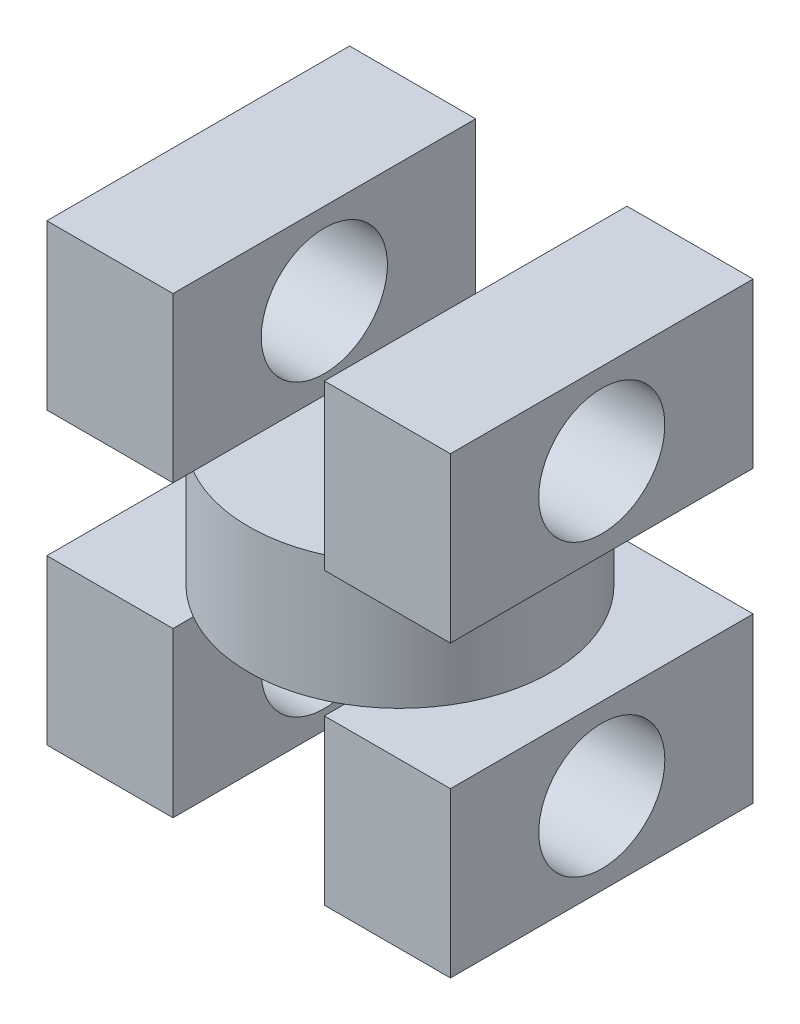
ISO-10303-21;
HEADER;
FILE_DESCRIPTION(('STEP AP214'),'2;1');
FILE_NAME('part.step','',(''),(''),'','','');
FILE_SCHEMA(('AUTOMOTIVE_DESIGN { 1 0 10303 214 1 1 1 1 }'));
ENDSEC;
DATA;
#1=APPLICATION_CONTEXT('core data for automotive mechanical design processes');
#2=APPLICATION_PROTOCOL_DEFINITION('international standard','automotive_design',2000,#1);
#3=PRODUCT_CONTEXT('',#1,'mechanical');
#4=PRODUCT('Part','Part','',(#3));
#5=PRODUCT_RELATED_PRODUCT_CATEGORY('part','',(#4));
#6=PRODUCT_DEFINITION_FORMATION('','',#4);
#7=PRODUCT_DEFINITION_CONTEXT('part definition',#1,'design');
#8=PRODUCT_DEFINITION('design','',#6,#7);
#9=PRODUCT_DEFINITION_SHAPE('','',#8);
#10=(LENGTH_UNIT() NAMED_UNIT(*) SI_UNIT(.MILLI.,.METRE.));
#11=(NAMED_UNIT(*) PLANE_ANGLE_UNIT() SI_UNIT($,.RADIAN.));
#12=(NAMED_UNIT(*) SI_UNIT($,.STERADIAN.) SOLID_ANGLE_UNIT());
#13=UNCERTAINTY_MEASURE_WITH_UNIT(LENGTH_MEASURE(1.E-05),#10,'distance_accuracy_value','');
#14=(GEOMETRIC_REPRESENTATION_CONTEXT(3) GLOBAL_UNCERTAINTY_ASSIGNED_CONTEXT((#13)) GLOBAL_UNIT_ASSIGNED_CONTEXT((#10,
#11,#12)) REPRESENTATION_CONTEXT('',''));
#15=CARTESIAN_POINT('',(0.,0.,0.));
#16=DIRECTION('',(0.,0.,1.));
#17=DIRECTION('',(1.,0.,0.));
#18=AXIS2_PLACEMENT_3D('',#15,#16,#17);
#19=CARTESIAN_POINT('',(-32.,-10.,24.));
#20=DIRECTION('',(0.,1.,0.));
#21=DIRECTION('',(0.,0.,1.));
#22=AXIS2_PLACEMENT_3D('',#19,#20,#21);
#23=PLANE('',#22);
#24=DIRECTION('',(1.,0.,0.));
#25=VECTOR('',#24,1.);
#26=CARTESIAN_POINT('',(-32.,-10.,0.));
#27=LINE('',#26,#25);
#28=CARTESIAN_POINT('',(-10.,-10.,0.));
#29=VERTEX_POINT('',#28);
#30=CARTESIAN_POINT('',(0.,-10.,0.));
#31=VERTEX_POINT('',#30);
#32=EDGE_CURVE('E240',#29,#31,#27,.T.);
#33=ORIENTED_EDGE('',*,*,#32,.F.);
#34=DIRECTION('',(0.,0.,-1.));
#35=VECTOR('',#34,1.);
#36=CARTESIAN_POINT('',(-10.,-10.,24.));
#37=LINE('',#36,#35);
#38=CARTESIAN_POINT('',(-10.,-10.,1.60769515458673));
#39=VERTEX_POINT('',#38);
#40=EDGE_CURVE('E61',#39,#29,#37,.T.);
#41=ORIENTED_EDGE('',*,*,#40,.F.);
#42=CARTESIAN_POINT('',(-16.,-10.,12.));
#43=DIRECTION('',(0.,-1.,0.));
#44=DIRECTION('',(0.,0.,-1.));
#45=AXIS2_PLACEMENT_3D('',#42,#43,#44);
#46=CIRCLE('',#45,12.);
#47=CARTESIAN_POINT('',(-10.,-10.,22.3923048454133));
#48=VERTEX_POINT('',#47);
#49=EDGE_CURVE('E204',#39,#48,#46,.T.);
#50=ORIENTED_EDGE('',*,*,#49,.T.);
#51=CARTESIAN_POINT('',(-10.,-10.,24.));
#52=VERTEX_POINT('',#51);
#53=EDGE_CURVE('E186',#52,#48,#37,.T.);
#54=ORIENTED_EDGE('',*,*,#53,.F.);
#55=DIRECTION('',(1.,0.,0.));
#56=VECTOR('',#55,1.);
#57=CARTESIAN_POINT('',(-32.,-10.,24.));
#58=LINE('',#57,#56);
#59=CARTESIAN_POINT('',(0.,-10.,24.));
#60=VERTEX_POINT('',#59);
#61=EDGE_CURVE('E201',#52,#60,#58,.T.);
#62=ORIENTED_EDGE('',*,*,#61,.T.);
#63=DIRECTION('',(0.,0.,-1.));
#64=VECTOR('',#63,1.);
#65=CARTESIAN_POINT('',(0.,-10.,24.));
#66=LINE('',#65,#64);
#67=EDGE_CURVE('E234',#60,#31,#66,.T.);
#68=ORIENTED_EDGE('',*,*,#67,.T.);
#69=EDGE_LOOP('',(#33,#41,#50,#54,#62,#68));
#70=FACE_BOUND('',#69,.T.);
#71=ADVANCED_FACE('F43',(#70),#23,.T.);
#72=CARTESIAN_POINT('',(-32.,-10.,24.));
#73=VERTEX_POINT('',#72);
#74=CARTESIAN_POINT('',(-22.,-10.,24.));
#75=VERTEX_POINT('',#74);
#76=EDGE_CURVE('E213',#73,#75,#58,.T.);
#77=ORIENTED_EDGE('',*,*,#76,.T.);
#78=DIRECTION('',(0.,0.,-1.));
#79=VECTOR('',#78,1.);
#80=CARTESIAN_POINT('',(-22.,-10.,24.));
#81=LINE('',#80,#79);
#82=CARTESIAN_POINT('',(-22.,-10.,22.3923048454133));
#83=VERTEX_POINT('',#82);
#84=EDGE_CURVE('E384',#75,#83,#81,.T.);
#85=ORIENTED_EDGE('',*,*,#84,.T.);
#86=CARTESIAN_POINT('',(-22.,-10.,1.60769515458674));
#87=VERTEX_POINT('',#86);
#88=EDGE_CURVE('E313',#83,#87,#46,.T.);
#89=ORIENTED_EDGE('',*,*,#88,.T.);
#90=CARTESIAN_POINT('',(-22.,-10.,0.));
#91=VERTEX_POINT('',#90);
#92=EDGE_CURVE('E389',#87,#91,#81,.T.);
#93=ORIENTED_EDGE('',*,*,#92,.T.);
#94=CARTESIAN_POINT('',(-32.,-10.,0.));
#95=VERTEX_POINT('',#94);
#96=EDGE_CURVE('E235',#95,#91,#27,.T.);
#97=ORIENTED_EDGE('',*,*,#96,.F.);
#98=DIRECTION('',(0.,0.,-1.));
#99=VECTOR('',#98,1.);
#100=CARTESIAN_POINT('',(-32.,-10.,24.));
#101=LINE('',#100,#99);
#102=EDGE_CURVE('E257',#73,#95,#101,.T.);
#103=ORIENTED_EDGE('',*,*,#102,.F.);
#104=EDGE_LOOP('',(#77,#85,#89,#93,#97,#103));
#105=FACE_BOUND('',#104,.T.);
#106=ADVANCED_FACE('F410',(#105),#23,.T.);
#107=CARTESIAN_POINT('',(0.,-23.,24.));
#108=DIRECTION('',(0.,-1.,0.));
#109=DIRECTION('',(1.,0.,0.));
#110=AXIS2_PLACEMENT_3D('',#107,#108,#109);
#111=PLANE('',#110);
#112=DIRECTION('',(-1.,0.,0.));
#113=VECTOR('',#112,1.);
#114=CARTESIAN_POINT('',(0.,-23.,0.));
#115=LINE('',#114,#113);
#116=CARTESIAN_POINT('',(-22.,-23.,0.));
#117=VERTEX_POINT('',#116);
#118=CARTESIAN_POINT('',(-32.,-23.,0.));
#119=VERTEX_POINT('',#118);
#120=EDGE_CURVE('E244',#117,#119,#115,.T.);
#121=ORIENTED_EDGE('',*,*,#120,.F.);
#122=DIRECTION('',(0.,0.,-1.));
#123=VECTOR('',#122,1.);
#124=CARTESIAN_POINT('',(-22.,-23.,24.));
#125=LINE('',#124,#123);
#126=CARTESIAN_POINT('',(-22.,-23.,24.));
#127=VERTEX_POINT('',#126);
#128=EDGE_CURVE('E390',#127,#117,#125,.T.);
#129=ORIENTED_EDGE('',*,*,#128,.F.);
#130=DIRECTION('',(-1.,0.,0.));
#131=VECTOR('',#130,1.);
#132=CARTESIAN_POINT('',(0.,-23.,24.));
#133=LINE('',#132,#131);
#134=CARTESIAN_POINT('',(-32.,-23.,24.));
#135=VERTEX_POINT('',#134);
#136=EDGE_CURVE('E228',#127,#135,#133,.T.);
#137=ORIENTED_EDGE('',*,*,#136,.T.);
#138=DIRECTION('',(0.,0.,-1.));
#139=VECTOR('',#138,1.);
#140=CARTESIAN_POINT('',(-32.,-23.,24.));
#141=LINE('',#140,#139);
#142=EDGE_CURVE('E253',#135,#119,#141,.T.);
#143=ORIENTED_EDGE('',*,*,#142,.T.);
#144=EDGE_LOOP('',(#121,#129,#137,#143));
#145=FACE_BOUND('',#144,.T.);
#146=ADVANCED_FACE('F430',(#145),#111,.T.);
#147=CARTESIAN_POINT('',(0.,-23.,24.));
#148=VERTEX_POINT('',#147);
#149=CARTESIAN_POINT('',(-10.,-23.,24.));
#150=VERTEX_POINT('',#149);
#151=EDGE_CURVE('E229',#148,#150,#133,.T.);
#152=ORIENTED_EDGE('',*,*,#151,.T.);
#153=DIRECTION('',(0.,0.,-1.));
#154=VECTOR('',#153,1.);
#155=CARTESIAN_POINT('',(-10.,-23.,24.));
#156=LINE('',#155,#154);
#157=CARTESIAN_POINT('',(-10.,-23.,0.));
#158=VERTEX_POINT('',#157);
#159=EDGE_CURVE('E189',#150,#158,#156,.T.);
#160=ORIENTED_EDGE('',*,*,#159,.T.);
#161=CARTESIAN_POINT('',(0.,-23.,0.));
#162=VERTEX_POINT('',#161);
#163=EDGE_CURVE('E221',#162,#158,#115,.T.);
#164=ORIENTED_EDGE('',*,*,#163,.F.);
#165=DIRECTION('',(0.,0.,-1.));
#166=VECTOR('',#165,1.);
#167=CARTESIAN_POINT('',(0.,-23.,24.));
#168=LINE('',#167,#166);
#169=EDGE_CURVE('E250',#148,#162,#168,.T.);
#170=ORIENTED_EDGE('',*,*,#169,.F.);
#171=EDGE_LOOP('',(#152,#160,#164,#170));
#172=FACE_BOUND('',#171,.T.);
#173=ADVANCED_FACE('F395',(#172),#111,.T.);
#174=CARTESIAN_POINT('',(0.,-10.,24.));
#175=DIRECTION('',(0.,0.,1.));
#176=DIRECTION('',(1.,0.,0.));
#177=AXIS2_PLACEMENT_3D('',#174,#175,#176);
#178=PLANE('',#177);
#179=ORIENTED_EDGE('',*,*,#136,.F.);
#180=DIRECTION('',(0.,-1.,0.));
#181=VECTOR('',#180,1.);
#182=CARTESIAN_POINT('',(-22.,-10.,24.));
#183=LINE('',#182,#181);
#184=EDGE_CURVE('E195',#75,#127,#183,.T.);
#185=ORIENTED_EDGE('',*,*,#184,.F.);
#186=ORIENTED_EDGE('',*,*,#76,.F.);
#187=DIRECTION('',(0.,1.,0.));
#188=VECTOR('',#187,1.);
#189=CARTESIAN_POINT('',(-32.,-23.,24.));
#190=LINE('',#189,#188);
#191=EDGE_CURVE('E219',#135,#73,#190,.T.);
#192=ORIENTED_EDGE('',*,*,#191,.F.);
#193=EDGE_LOOP('',(#179,#185,#186,#192));
#194=FACE_BOUND('',#193,.T.);
#195=ADVANCED_FACE('F426',(#194),#178,.T.);
#196=ORIENTED_EDGE('',*,*,#61,.F.);
#197=DIRECTION('',(0.,1.,0.));
#198=VECTOR('',#197,1.);
#199=CARTESIAN_POINT('',(-10.,-10.,24.));
#200=LINE('',#199,#198);
#201=EDGE_CURVE('E183',#150,#52,#200,.T.);
#202=ORIENTED_EDGE('',*,*,#201,.F.);
#203=ORIENTED_EDGE('',*,*,#151,.F.);
#204=DIRECTION('',(0.,-1.,0.));
#205=VECTOR('',#204,1.);
#206=CARTESIAN_POINT('',(0.,-10.,24.));
#207=LINE('',#206,#205);
#208=EDGE_CURVE('E211',#60,#148,#207,.T.);
#209=ORIENTED_EDGE('',*,*,#208,.F.);
#210=EDGE_LOOP('',(#196,#202,#203,#209));
#211=FACE_BOUND('',#210,.T.);
#212=ADVANCED_FACE('F209',(#211),#178,.T.);
#213=CARTESIAN_POINT('',(0.,-10.,0.));
#214=DIRECTION('',(0.,0.,1.));
#215=DIRECTION('',(1.,0.,0.));
#216=AXIS2_PLACEMENT_3D('',#213,#214,#215);
#217=PLANE('',#216);
#218=DIRECTION('',(0.,-1.,0.));
#219=VECTOR('',#218,1.);
#220=CARTESIAN_POINT('',(-22.,-10.,0.));
#221=LINE('',#220,#219);
#222=EDGE_CURVE('E196',#91,#117,#221,.T.);
#223=ORIENTED_EDGE('',*,*,#222,.T.);
#224=ORIENTED_EDGE('',*,*,#120,.T.);
#225=DIRECTION('',(0.,1.,0.));
#226=VECTOR('',#225,1.);
#227=CARTESIAN_POINT('',(-32.,-23.,0.));
#228=LINE('',#227,#226);
#229=EDGE_CURVE('E239',#119,#95,#228,.T.);
#230=ORIENTED_EDGE('',*,*,#229,.T.);
#231=ORIENTED_EDGE('',*,*,#96,.T.);
#232=EDGE_LOOP('',(#223,#224,#230,#231));
#233=FACE_BOUND('',#232,.T.);
#234=ADVANCED_FACE('F415',(#233),#217,.F.);
#235=DIRECTION('',(0.,1.,0.));
#236=VECTOR('',#235,1.);
#237=CARTESIAN_POINT('',(-10.,-10.,0.));
#238=LINE('',#237,#236);
#239=EDGE_CURVE('E363',#158,#29,#238,.T.);
#240=ORIENTED_EDGE('',*,*,#239,.T.);
#241=ORIENTED_EDGE('',*,*,#32,.T.);
#242=DIRECTION('',(0.,-1.,0.));
#243=VECTOR('',#242,1.);
#244=CARTESIAN_POINT('',(0.,-10.,0.));
#245=LINE('',#244,#243);
#246=EDGE_CURVE('E214',#31,#162,#245,.T.);
#247=ORIENTED_EDGE('',*,*,#246,.T.);
#248=ORIENTED_EDGE('',*,*,#163,.T.);
#249=EDGE_LOOP('',(#240,#241,#247,#248));
#250=FACE_BOUND('',#249,.T.);
#251=ADVANCED_FACE('F397',(#250),#217,.F.);
#252=CARTESIAN_POINT('',(0.,0.,0.));
#253=DIRECTION('',(0.,-1.,0.));
#254=DIRECTION('',(0.,0.,-1.));
#255=AXIS2_PLACEMENT_3D('',#252,#253,#254);
#256=PLANE('',#255);
#257=DIRECTION('',(0.,0.,-1.));
#258=VECTOR('',#257,1.);
#259=CARTESIAN_POINT('',(-22.,0.,24.));
#260=LINE('',#259,#258);
#261=CARTESIAN_POINT('',(-22.,0.,22.3923048454133));
#262=VERTEX_POINT('',#261);
#263=CARTESIAN_POINT('',(-22.,0.,1.60769515458674));
#264=VERTEX_POINT('',#263);
#265=EDGE_CURVE('E69',#262,#264,#260,.T.);
#266=ORIENTED_EDGE('',*,*,#265,.F.);
#267=CARTESIAN_POINT('',(-16.,0.,12.));
#268=DIRECTION('',(0.,-1.,0.));
#269=DIRECTION('',(0.,0.,-1.));
#270=AXIS2_PLACEMENT_3D('',#267,#268,#269);
#271=CIRCLE('',#270,12.);
#272=CARTESIAN_POINT('',(-10.,0.,22.3923048454133));
#273=VERTEX_POINT('',#272);
#274=EDGE_CURVE('E314',#273,#262,#271,.T.);
#275=ORIENTED_EDGE('',*,*,#274,.F.);
#276=DIRECTION('',(0.,0.,-1.));
#277=VECTOR('',#276,1.);
#278=CARTESIAN_POINT('',(-10.,0.,24.));
#279=LINE('',#278,#277);
#280=CARTESIAN_POINT('',(-10.,0.,1.60769515458673));
#281=VERTEX_POINT('',#280);
#282=EDGE_CURVE('E337',#273,#281,#279,.T.);
#283=ORIENTED_EDGE('',*,*,#282,.T.);
#284=EDGE_CURVE('E303',#264,#281,#271,.T.);
#285=ORIENTED_EDGE('',*,*,#284,.F.);
#286=EDGE_LOOP('',(#266,#275,#283,#285));
#287=FACE_BOUND('',#286,.T.);
#288=ADVANCED_FACE('F451',(#287),#256,.F.);
#289=CARTESIAN_POINT('',(-32.,0.,24.));
#290=DIRECTION('',(0.,1.,0.));
#291=DIRECTION('',(0.,0.,1.));
#292=AXIS2_PLACEMENT_3D('',#289,#290,#291);
#293=PLANE('',#292);
#294=EDGE_CURVE('E309',#281,#273,#271,.T.);
#295=ORIENTED_EDGE('',*,*,#294,.F.);
#296=CARTESIAN_POINT('',(-10.,0.,0.));
#297=VERTEX_POINT('',#296);
#298=EDGE_CURVE('E307',#281,#297,#279,.T.);
#299=ORIENTED_EDGE('',*,*,#298,.T.);
#300=DIRECTION('',(1.,0.,0.));
#301=VECTOR('',#300,1.);
#302=CARTESIAN_POINT('',(-32.,0.,0.));
#303=LINE('',#302,#301);
#304=CARTESIAN_POINT('',(0.,0.,0.));
#305=VERTEX_POINT('',#304);
#306=EDGE_CURVE('E336',#297,#305,#303,.T.);
#307=ORIENTED_EDGE('',*,*,#306,.T.);
#308=DIRECTION('',(0.,0.,-1.));
#309=VECTOR('',#308,1.);
#310=CARTESIAN_POINT('',(0.,0.,24.));
#311=LINE('',#310,#309);
#312=CARTESIAN_POINT('',(0.,0.,24.));
#313=VERTEX_POINT('',#312);
#314=EDGE_CURVE('E315',#313,#305,#311,.T.);
#315=ORIENTED_EDGE('',*,*,#314,.F.);
#316=DIRECTION('',(1.,0.,0.));
#317=VECTOR('',#316,1.);
#318=CARTESIAN_POINT('',(-32.,0.,24.));
#319=LINE('',#318,#317);
#320=CARTESIAN_POINT('',(-10.,0.,24.));
#321=VERTEX_POINT('',#320);
#322=EDGE_CURVE('E331',#321,#313,#319,.T.);
#323=ORIENTED_EDGE('',*,*,#322,.F.);
#324=EDGE_CURVE('E333',#321,#273,#279,.T.);
#325=ORIENTED_EDGE('',*,*,#324,.T.);
#326=EDGE_LOOP('',(#295,#299,#307,#315,#323,#325));
#327=FACE_BOUND('',#326,.T.);
#328=ADVANCED_FACE('F45',(#327),#293,.F.);
#329=CARTESIAN_POINT('',(0.,13.,24.));
#330=DIRECTION('',(0.,-1.,0.));
#331=DIRECTION('',(1.,0.,0.));
#332=AXIS2_PLACEMENT_3D('',#329,#330,#331);
#333=PLANE('',#332);
#334=DIRECTION('',(-1.,0.,0.));
#335=VECTOR('',#334,1.);
#336=CARTESIAN_POINT('',(0.,13.,0.));
#337=LINE('',#336,#335);
#338=CARTESIAN_POINT('',(0.,13.,0.));
#339=VERTEX_POINT('',#338);
#340=CARTESIAN_POINT('',(-10.,13.,0.));
#341=VERTEX_POINT('',#340);
#342=EDGE_CURVE('E325',#339,#341,#337,.T.);
#343=ORIENTED_EDGE('',*,*,#342,.T.);
#344=DIRECTION('',(0.,0.,-1.));
#345=VECTOR('',#344,1.);
#346=CARTESIAN_POINT('',(-10.,13.,24.));
#347=LINE('',#346,#345);
#348=CARTESIAN_POINT('',(-10.,13.,24.));
#349=VERTEX_POINT('',#348);
#350=EDGE_CURVE('E11',#349,#341,#347,.T.);
#351=ORIENTED_EDGE('',*,*,#350,.F.);
#352=DIRECTION('',(-1.,0.,0.));
#353=VECTOR('',#352,1.);
#354=CARTESIAN_POINT('',(0.,13.,24.));
#355=LINE('',#354,#353);
#356=CARTESIAN_POINT('',(0.,13.,24.));
#357=VERTEX_POINT('',#356);
#358=EDGE_CURVE('E328',#357,#349,#355,.T.);
#359=ORIENTED_EDGE('',*,*,#358,.F.);
#360=DIRECTION('',(0.,0.,-1.));
#361=VECTOR('',#360,1.);
#362=CARTESIAN_POINT('',(0.,13.,24.));
#363=LINE('',#362,#361);
#364=EDGE_CURVE('E320',#357,#339,#363,.T.);
#365=ORIENTED_EDGE('',*,*,#364,.T.);
#366=EDGE_LOOP('',(#343,#351,#359,#365));
#367=FACE_BOUND('',#366,.T.);
#368=ADVANCED_FACE('F595',(#367),#333,.F.);
#369=CARTESIAN_POINT('',(0.,0.,24.));
#370=DIRECTION('',(0.,0.,1.));
#371=DIRECTION('',(1.,0.,0.));
#372=AXIS2_PLACEMENT_3D('',#369,#370,#371);
#373=PLANE('',#372);
#374=DIRECTION('',(0.,-1.,0.));
#375=VECTOR('',#374,1.);
#376=CARTESIAN_POINT('',(-10.,0.,24.));
#377=LINE('',#376,#375);
#378=EDGE_CURVE('E324',#349,#321,#377,.T.);
#379=ORIENTED_EDGE('',*,*,#378,.T.);
#380=ORIENTED_EDGE('',*,*,#322,.T.);
#381=DIRECTION('',(0.,1.,0.));
#382=VECTOR('',#381,1.);
#383=CARTESIAN_POINT('',(0.,0.,24.));
#384=LINE('',#383,#382);
#385=EDGE_CURVE('E329',#313,#357,#384,.T.);
#386=ORIENTED_EDGE('',*,*,#385,.T.);
#387=ORIENTED_EDGE('',*,*,#358,.T.);
#388=EDGE_LOOP('',(#379,#380,#386,#387));
#389=FACE_BOUND('',#388,.T.);
#390=ADVANCED_FACE('F601',(#389),#373,.T.);
#391=CARTESIAN_POINT('',(0.,0.,0.));
#392=DIRECTION('',(0.,0.,1.));
#393=DIRECTION('',(1.,0.,0.));
#394=AXIS2_PLACEMENT_3D('',#391,#392,#393);
#395=PLANE('',#394);
#396=ORIENTED_EDGE('',*,*,#306,.F.);
#397=DIRECTION('',(0.,-1.,0.));
#398=VECTOR('',#397,1.);
#399=CARTESIAN_POINT('',(-10.,0.,0.));
#400=LINE('',#399,#398);
#401=EDGE_CURVE('E53',#341,#297,#400,.T.);
#402=ORIENTED_EDGE('',*,*,#401,.F.);
#403=ORIENTED_EDGE('',*,*,#342,.F.);
#404=DIRECTION('',(0.,1.,0.));
#405=VECTOR('',#404,1.);
#406=CARTESIAN_POINT('',(0.,0.,0.));
#407=LINE('',#406,#405);
#408=EDGE_CURVE('E319',#305,#339,#407,.T.);
#409=ORIENTED_EDGE('',*,*,#408,.F.);
#410=EDGE_LOOP('',(#396,#402,#403,#409));
#411=FACE_BOUND('',#410,.T.);
#412=ADVANCED_FACE('F608',(#411),#395,.F.);
#413=CARTESIAN_POINT('',(0.,0.,24.));
#414=DIRECTION('',(-1.,0.,0.));
#415=DIRECTION('',(0.,0.,1.));
#416=AXIS2_PLACEMENT_3D('',#413,#414,#415);
#417=PLANE('',#416);
#418=CARTESIAN_POINT('',(0.,6.5,12.));
#419=DIRECTION('',(-1.,0.,0.));
#420=DIRECTION('',(0.,0.,1.));
#421=AXIS2_PLACEMENT_3D('',#418,#419,#420);
#422=CIRCLE('',#421,5.);
#423=CARTESIAN_POINT('',(0.,6.5,17.));
#424=VERTEX_POINT('',#423);
#425=EDGE_CURVE('E513',#424,#424,#422,.T.);
#426=ORIENTED_EDGE('',*,*,#425,.T.);
#427=EDGE_LOOP('',(#426));
#428=FACE_BOUND('',#427,.T.);
#429=ORIENTED_EDGE('',*,*,#408,.T.);
#430=ORIENTED_EDGE('',*,*,#364,.F.);
#431=ORIENTED_EDGE('',*,*,#385,.F.);
#432=ORIENTED_EDGE('',*,*,#314,.T.);
#433=EDGE_LOOP('',(#429,#430,#431,#432));
#434=FACE_BOUND('',#433,.T.);
#435=ADVANCED_FACE('F615',(#428,#434),#417,.F.);
#436=CARTESIAN_POINT('',(-10.,0.,24.));
#437=DIRECTION('',(1.,0.,0.));
#438=DIRECTION('',(0.,1.,0.));
#439=AXIS2_PLACEMENT_3D('',#436,#437,#438);
#440=PLANE('',#439);
#441=CARTESIAN_POINT('',(-10.,6.5,12.));
#442=DIRECTION('',(1.,0.,0.));
#443=DIRECTION('',(0.,1.,0.));
#444=AXIS2_PLACEMENT_3D('',#441,#442,#443);
#445=CIRCLE('',#444,5.);
#446=CARTESIAN_POINT('',(-10.,11.5,12.));
#447=VERTEX_POINT('',#446);
#448=EDGE_CURVE('E372',#447,#447,#445,.T.);
#449=ORIENTED_EDGE('',*,*,#448,.T.);
#450=EDGE_LOOP('',(#449));
#451=FACE_BOUND('',#450,.T.);
#452=ORIENTED_EDGE('',*,*,#401,.T.);
#453=ORIENTED_EDGE('',*,*,#298,.F.);
#454=ORIENTED_EDGE('',*,*,#282,.F.);
#455=ORIENTED_EDGE('',*,*,#324,.F.);
#456=ORIENTED_EDGE('',*,*,#378,.F.);
#457=ORIENTED_EDGE('',*,*,#350,.T.);
#458=EDGE_LOOP('',(#452,#453,#454,#455,#456,#457));
#459=FACE_BOUND('',#458,.T.);
#460=ADVANCED_FACE('F454',(#451,#459),#440,.F.);
#461=CARTESIAN_POINT('',(-16.,-10.,12.));
#462=DIRECTION('',(0.,1.,0.));
#463=DIRECTION('',(0.,0.,1.));
#464=AXIS2_PLACEMENT_3D('',#461,#462,#463);
#465=CYLINDRICAL_SURFACE('',#464,12.);
#466=EDGE_CURVE('E304',#87,#39,#46,.T.);
#467=ORIENTED_EDGE('',*,*,#466,.F.);
#468=ORIENTED_EDGE('',*,*,#88,.F.);
#469=EDGE_CURVE('E308',#48,#83,#46,.T.);
#470=ORIENTED_EDGE('',*,*,#469,.F.);
#471=ORIENTED_EDGE('',*,*,#49,.F.);
#472=EDGE_LOOP('',(#467,#468,#470,#471));
#473=FACE_BOUND('',#472,.T.);
#474=ORIENTED_EDGE('',*,*,#294,.T.);
#475=ORIENTED_EDGE('',*,*,#274,.T.);
#476=EDGE_CURVE('E437',#262,#264,#271,.T.);
#477=ORIENTED_EDGE('',*,*,#476,.T.);
#478=ORIENTED_EDGE('',*,*,#284,.T.);
#479=EDGE_LOOP('',(#474,#475,#477,#478));
#480=FACE_BOUND('',#479,.T.);
#481=ADVANCED_FACE('F463',(#473,#480),#465,.T.);
#482=CARTESIAN_POINT('',(-32.,13.,24.));
#483=DIRECTION('',(1.,0.,0.));
#484=DIRECTION('',(0.,0.,-1.));
#485=AXIS2_PLACEMENT_3D('',#482,#483,#484);
#486=PLANE('',#485);
#487=CARTESIAN_POINT('',(-32.,6.5,12.));
#488=DIRECTION('',(-1.,0.,0.));
#489=DIRECTION('',(0.,0.,1.));
#490=AXIS2_PLACEMENT_3D('',#487,#488,#489);
#491=CIRCLE('',#490,5.);
#492=CARTESIAN_POINT('',(-32.,6.5,17.));
#493=VERTEX_POINT('',#492);
#494=EDGE_CURVE('E518',#493,#493,#491,.T.);
#495=ORIENTED_EDGE('',*,*,#494,.F.);
#496=EDGE_LOOP('',(#495));
#497=FACE_BOUND('',#496,.T.);
#498=DIRECTION('',(0.,-1.,0.));
#499=VECTOR('',#498,1.);
#500=CARTESIAN_POINT('',(-32.,13.,0.));
#501=LINE('',#500,#499);
#502=CARTESIAN_POINT('',(-32.,13.,0.));
#503=VERTEX_POINT('',#502);
#504=CARTESIAN_POINT('',(-32.,0.,0.));
#505=VERTEX_POINT('',#504);
#506=EDGE_CURVE('E281',#503,#505,#501,.T.);
#507=ORIENTED_EDGE('',*,*,#506,.T.);
#508=DIRECTION('',(0.,0.,-1.));
#509=VECTOR('',#508,1.);
#510=CARTESIAN_POINT('',(-32.,0.,24.));
#511=LINE('',#510,#509);
#512=CARTESIAN_POINT('',(-32.,0.,24.));
#513=VERTEX_POINT('',#512);
#514=EDGE_CURVE('E287',#513,#505,#511,.T.);
#515=ORIENTED_EDGE('',*,*,#514,.F.);
#516=DIRECTION('',(0.,-1.,0.));
#517=VECTOR('',#516,1.);
#518=CARTESIAN_POINT('',(-32.,13.,24.));
#519=LINE('',#518,#517);
#520=CARTESIAN_POINT('',(-32.,13.,24.));
#521=VERTEX_POINT('',#520);
#522=EDGE_CURVE('E284',#521,#513,#519,.T.);
#523=ORIENTED_EDGE('',*,*,#522,.F.);
#524=DIRECTION('',(0.,0.,-1.));
#525=VECTOR('',#524,1.);
#526=CARTESIAN_POINT('',(-32.,13.,24.));
#527=LINE('',#526,#525);
#528=EDGE_CURVE('E299',#521,#503,#527,.T.);
#529=ORIENTED_EDGE('',*,*,#528,.T.);
#530=EDGE_LOOP('',(#507,#515,#523,#529));
#531=FACE_BOUND('',#530,.T.);
#532=ADVANCED_FACE('F480',(#497,#531),#486,.F.);
#533=CARTESIAN_POINT('',(0.,0.,0.));
#534=DIRECTION('',(0.,0.,1.));
#535=DIRECTION('',(1.,0.,0.));
#536=AXIS2_PLACEMENT_3D('',#533,#534,#535);
#537=PLANE('',#536);
#538=DIRECTION('',(-1.,0.,0.));
#539=VECTOR('',#538,1.);
#540=CARTESIAN_POINT('',(0.,13.,0.));
#541=LINE('',#540,#539);
#542=CARTESIAN_POINT('',(-22.,13.,0.));
#543=VERTEX_POINT('',#542);
#544=EDGE_CURVE('E291',#543,#503,#541,.T.);
#545=ORIENTED_EDGE('',*,*,#544,.F.);
#546=DIRECTION('',(0.,1.,0.));
#547=VECTOR('',#546,1.);
#548=CARTESIAN_POINT('',(-22.,0.,0.));
#549=LINE('',#548,#547);
#550=CARTESIAN_POINT('',(-22.,0.,0.));
#551=VERTEX_POINT('',#550);
#552=EDGE_CURVE('E260',#551,#543,#549,.T.);
#553=ORIENTED_EDGE('',*,*,#552,.F.);
#554=DIRECTION('',(1.,0.,0.));
#555=VECTOR('',#554,1.);
#556=CARTESIAN_POINT('',(-32.,0.,0.));
#557=LINE('',#556,#555);
#558=EDGE_CURVE('E272',#505,#551,#557,.T.);
#559=ORIENTED_EDGE('',*,*,#558,.F.);
#560=ORIENTED_EDGE('',*,*,#506,.F.);
#561=EDGE_LOOP('',(#545,#553,#559,#560));
#562=FACE_BOUND('',#561,.T.);
#563=ADVANCED_FACE('F484',(#562),#537,.F.);
#564=CARTESIAN_POINT('',(0.,0.,24.));
#565=DIRECTION('',(0.,0.,1.));
#566=DIRECTION('',(1.,0.,0.));
#567=AXIS2_PLACEMENT_3D('',#564,#565,#566);
#568=PLANE('',#567);
#569=DIRECTION('',(0.,1.,0.));
#570=VECTOR('',#569,1.);
#571=CARTESIAN_POINT('',(-22.,0.,24.));
#572=LINE('',#571,#570);
#573=CARTESIAN_POINT('',(-22.,0.,24.));
#574=VERTEX_POINT('',#573);
#575=CARTESIAN_POINT('',(-22.,13.,24.));
#576=VERTEX_POINT('',#575);
#577=EDGE_CURVE('E261',#574,#576,#572,.T.);
#578=ORIENTED_EDGE('',*,*,#577,.T.);
#579=DIRECTION('',(-1.,0.,0.));
#580=VECTOR('',#579,1.);
#581=CARTESIAN_POINT('',(0.,13.,24.));
#582=LINE('',#581,#580);
#583=EDGE_CURVE('E280',#576,#521,#582,.T.);
#584=ORIENTED_EDGE('',*,*,#583,.T.);
#585=ORIENTED_EDGE('',*,*,#522,.T.);
#586=DIRECTION('',(1.,0.,0.));
#587=VECTOR('',#586,1.);
#588=CARTESIAN_POINT('',(-32.,0.,24.));
#589=LINE('',#588,#587);
#590=EDGE_CURVE('E276',#513,#574,#589,.T.);
#591=ORIENTED_EDGE('',*,*,#590,.T.);
#592=EDGE_LOOP('',(#578,#584,#585,#591));
#593=FACE_BOUND('',#592,.T.);
#594=ADVANCED_FACE('F471',(#593),#568,.T.);
#595=CARTESIAN_POINT('',(0.,13.,24.));
#596=DIRECTION('',(0.,-1.,0.));
#597=DIRECTION('',(1.,0.,0.));
#598=AXIS2_PLACEMENT_3D('',#595,#596,#597);
#599=PLANE('',#598);
#600=ORIENTED_EDGE('',*,*,#583,.F.);
#601=DIRECTION('',(0.,0.,-1.));
#602=VECTOR('',#601,1.);
#603=CARTESIAN_POINT('',(-22.,13.,24.));
#604=LINE('',#603,#602);
#605=EDGE_CURVE('E268',#576,#543,#604,.T.);
#606=ORIENTED_EDGE('',*,*,#605,.T.);
#607=ORIENTED_EDGE('',*,*,#544,.T.);
#608=ORIENTED_EDGE('',*,*,#528,.F.);
#609=EDGE_LOOP('',(#600,#606,#607,#608));
#610=FACE_BOUND('',#609,.T.);
#611=ADVANCED_FACE('F474',(#610),#599,.F.);
#612=CARTESIAN_POINT('',(-32.,0.,24.));
#613=DIRECTION('',(0.,1.,0.));
#614=DIRECTION('',(0.,0.,1.));
#615=AXIS2_PLACEMENT_3D('',#612,#613,#614);
#616=PLANE('',#615);
#617=EDGE_CURVE('E265',#264,#551,#260,.T.);
#618=ORIENTED_EDGE('',*,*,#617,.F.);
#619=ORIENTED_EDGE('',*,*,#476,.F.);
#620=EDGE_CURVE('E273',#574,#262,#260,.T.);
#621=ORIENTED_EDGE('',*,*,#620,.F.);
#622=ORIENTED_EDGE('',*,*,#590,.F.);
#623=ORIENTED_EDGE('',*,*,#514,.T.);
#624=ORIENTED_EDGE('',*,*,#558,.T.);
#625=EDGE_LOOP('',(#618,#619,#621,#622,#623,#624));
#626=FACE_BOUND('',#625,.T.);
#627=ADVANCED_FACE('F466',(#626),#616,.F.);
#628=CARTESIAN_POINT('',(-22.,0.,24.));
#629=DIRECTION('',(-1.,0.,0.));
#630=DIRECTION('',(0.,0.,1.));
#631=AXIS2_PLACEMENT_3D('',#628,#629,#630);
#632=PLANE('',#631);
#633=CARTESIAN_POINT('',(-22.,6.5,12.));
#634=DIRECTION('',(-1.,0.,0.));
#635=DIRECTION('',(0.,0.,1.));
#636=AXIS2_PLACEMENT_3D('',#633,#634,#635);
#637=CIRCLE('',#636,5.);
#638=CARTESIAN_POINT('',(-22.,6.5,17.));
#639=VERTEX_POINT('',#638);
#640=EDGE_CURVE('E47',#639,#639,#637,.T.);
#641=ORIENTED_EDGE('',*,*,#640,.T.);
#642=EDGE_LOOP('',(#641));
#643=FACE_BOUND('',#642,.T.);
#644=ORIENTED_EDGE('',*,*,#552,.T.);
#645=ORIENTED_EDGE('',*,*,#605,.F.);
#646=ORIENTED_EDGE('',*,*,#577,.F.);
#647=ORIENTED_EDGE('',*,*,#620,.T.);
#648=ORIENTED_EDGE('',*,*,#265,.T.);
#649=ORIENTED_EDGE('',*,*,#617,.T.);
#650=EDGE_LOOP('',(#644,#645,#646,#647,#648,#649));
#651=FACE_BOUND('',#650,.T.);
#652=ADVANCED_FACE('F468',(#643,#651),#632,.F.);
#653=CARTESIAN_POINT('',(-32.,-23.,24.));
#654=DIRECTION('',(-1.,0.,0.));
#655=DIRECTION('',(0.,0.,1.));
#656=AXIS2_PLACEMENT_3D('',#653,#654,#655);
#657=PLANE('',#656);
#658=CARTESIAN_POINT('',(-32.,-16.5,12.));
#659=DIRECTION('',(1.,0.,0.));
#660=DIRECTION('',(0.,0.,-1.));
#661=AXIS2_PLACEMENT_3D('',#658,#659,#660);
#662=CIRCLE('',#661,5.);
#663=CARTESIAN_POINT('',(-32.,-16.5,7.));
#664=VERTEX_POINT('',#663);
#665=EDGE_CURVE('E357',#664,#664,#662,.T.);
#666=ORIENTED_EDGE('',*,*,#665,.T.);
#667=EDGE_LOOP('',(#666));
#668=FACE_BOUND('',#667,.T.);
#669=ORIENTED_EDGE('',*,*,#229,.F.);
#670=ORIENTED_EDGE('',*,*,#142,.F.);
#671=ORIENTED_EDGE('',*,*,#191,.T.);
#672=ORIENTED_EDGE('',*,*,#102,.T.);
#673=EDGE_LOOP('',(#669,#670,#671,#672));
#674=FACE_BOUND('',#673,.T.);
#675=ADVANCED_FACE('F420',(#668,#674),#657,.T.);
#676=CARTESIAN_POINT('',(0.,-10.,24.));
#677=DIRECTION('',(1.,0.,0.));
#678=DIRECTION('',(0.,0.,-1.));
#679=AXIS2_PLACEMENT_3D('',#676,#677,#678);
#680=PLANE('',#679);
#681=CARTESIAN_POINT('',(0.,-16.5,12.));
#682=DIRECTION('',(1.,0.,0.));
#683=DIRECTION('',(0.,0.,-1.));
#684=AXIS2_PLACEMENT_3D('',#681,#682,#683);
#685=CIRCLE('',#684,5.);
#686=CARTESIAN_POINT('',(0.,-16.5,7.));
#687=VERTEX_POINT('',#686);
#688=EDGE_CURVE('E366',#687,#687,#685,.T.);
#689=ORIENTED_EDGE('',*,*,#688,.F.);
#690=EDGE_LOOP('',(#689));
#691=FACE_BOUND('',#690,.T.);
#692=ORIENTED_EDGE('',*,*,#246,.F.);
#693=ORIENTED_EDGE('',*,*,#67,.F.);
#694=ORIENTED_EDGE('',*,*,#208,.T.);
#695=ORIENTED_EDGE('',*,*,#169,.T.);
#696=EDGE_LOOP('',(#692,#693,#694,#695));
#697=FACE_BOUND('',#696,.T.);
#698=ADVANCED_FACE('F400',(#691,#697),#680,.T.);
#699=CARTESIAN_POINT('',(0.,-10.,24.));
#700=DIRECTION('',(0.,-1.,0.));
#701=DIRECTION('',(0.,0.,-1.));
#702=AXIS2_PLACEMENT_3D('',#699,#700,#701);
#703=PLANE('',#702);
#704=EDGE_CURVE('E206',#48,#39,#37,.T.);
#705=ORIENTED_EDGE('',*,*,#704,.F.);
#706=ORIENTED_EDGE('',*,*,#469,.T.);
#707=EDGE_CURVE('E388',#83,#87,#81,.T.);
#708=ORIENTED_EDGE('',*,*,#707,.T.);
#709=ORIENTED_EDGE('',*,*,#466,.T.);
#710=EDGE_LOOP('',(#705,#706,#708,#709));
#711=FACE_BOUND('',#710,.T.);
#712=ADVANCED_FACE('F543',(#711),#703,.T.);
#713=CARTESIAN_POINT('',(-22.,-10.,24.));
#714=DIRECTION('',(1.,0.,0.));
#715=DIRECTION('',(0.,0.,-1.));
#716=AXIS2_PLACEMENT_3D('',#713,#714,#715);
#717=PLANE('',#716);
#718=CARTESIAN_POINT('',(-22.,-16.5,12.));
#719=DIRECTION('',(1.,0.,0.));
#720=DIRECTION('',(0.,0.,-1.));
#721=AXIS2_PLACEMENT_3D('',#718,#719,#720);
#722=CIRCLE('',#721,5.);
#723=CARTESIAN_POINT('',(-22.,-16.5,7.));
#724=VERTEX_POINT('',#723);
#725=EDGE_CURVE('E356',#724,#724,#722,.T.);
#726=ORIENTED_EDGE('',*,*,#725,.F.);
#727=EDGE_LOOP('',(#726));
#728=FACE_BOUND('',#727,.T.);
#729=ORIENTED_EDGE('',*,*,#222,.F.);
#730=ORIENTED_EDGE('',*,*,#92,.F.);
#731=ORIENTED_EDGE('',*,*,#707,.F.);
#732=ORIENTED_EDGE('',*,*,#84,.F.);
#733=ORIENTED_EDGE('',*,*,#184,.T.);
#734=ORIENTED_EDGE('',*,*,#128,.T.);
#735=EDGE_LOOP('',(#729,#730,#731,#732,#733,#734));
#736=FACE_BOUND('',#735,.T.);
#737=ADVANCED_FACE('F428',(#728,#736),#717,.T.);
#738=CARTESIAN_POINT('',(-10.,-10.,24.));
#739=DIRECTION('',(-1.,0.,0.));
#740=DIRECTION('',(0.,-1.,0.));
#741=AXIS2_PLACEMENT_3D('',#738,#739,#740);
#742=PLANE('',#741);
#743=CARTESIAN_POINT('',(-10.,-16.5,12.));
#744=DIRECTION('',(-1.,0.,0.));
#745=DIRECTION('',(0.,-1.,0.));
#746=AXIS2_PLACEMENT_3D('',#743,#744,#745);
#747=CIRCLE('',#746,5.);
#748=CARTESIAN_POINT('',(-10.,-21.5,12.));
#749=VERTEX_POINT('',#748);
#750=EDGE_CURVE('E353',#749,#749,#747,.T.);
#751=ORIENTED_EDGE('',*,*,#750,.F.);
#752=EDGE_LOOP('',(#751));
#753=FACE_BOUND('',#752,.T.);
#754=ORIENTED_EDGE('',*,*,#239,.F.);
#755=ORIENTED_EDGE('',*,*,#159,.F.);
#756=ORIENTED_EDGE('',*,*,#201,.T.);
#757=ORIENTED_EDGE('',*,*,#53,.T.);
#758=ORIENTED_EDGE('',*,*,#704,.T.);
#759=ORIENTED_EDGE('',*,*,#40,.T.);
#760=EDGE_LOOP('',(#754,#755,#756,#757,#758,#759));
#761=FACE_BOUND('',#760,.T.);
#762=ADVANCED_FACE('F185',(#753,#761),#742,.T.);
#763=CARTESIAN_POINT('',(-32.,-16.5,12.));
#764=DIRECTION('',(1.,0.,0.));
#765=DIRECTION('',(0.,0.,-1.));
#766=AXIS2_PLACEMENT_3D('',#763,#764,#765);
#767=CYLINDRICAL_SURFACE('',#766,5.);
#768=ORIENTED_EDGE('',*,*,#750,.T.);
#769=EDGE_LOOP('',(#768));
#770=FACE_BOUND('',#769,.T.);
#771=ORIENTED_EDGE('',*,*,#688,.T.);
#772=EDGE_LOOP('',(#771));
#773=FACE_BOUND('',#772,.T.);
#774=ADVANCED_FACE('F536',(#770,#773),#767,.F.);
#775=ORIENTED_EDGE('',*,*,#725,.T.);
#776=EDGE_LOOP('',(#775));
#777=FACE_BOUND('',#776,.T.);
#778=ORIENTED_EDGE('',*,*,#665,.F.);
#779=EDGE_LOOP('',(#778));
#780=FACE_BOUND('',#779,.T.);
#781=ADVANCED_FACE('F529',(#777,#780),#767,.F.);
#782=CARTESIAN_POINT('',(0.,6.5,12.));
#783=DIRECTION('',(-1.,0.,0.));
#784=DIRECTION('',(0.,0.,1.));
#785=AXIS2_PLACEMENT_3D('',#782,#783,#784);
#786=CYLINDRICAL_SURFACE('',#785,5.);
#787=ORIENTED_EDGE('',*,*,#494,.T.);
#788=EDGE_LOOP('',(#787));
#789=FACE_BOUND('',#788,.T.);
#790=ORIENTED_EDGE('',*,*,#640,.F.);
#791=EDGE_LOOP('',(#790));
#792=FACE_BOUND('',#791,.T.);
#793=ADVANCED_FACE('F526',(#789,#792),#786,.F.);
#794=ORIENTED_EDGE('',*,*,#425,.F.);
#795=EDGE_LOOP('',(#794));
#796=FACE_BOUND('',#795,.T.);
#797=ORIENTED_EDGE('',*,*,#448,.F.);
#798=EDGE_LOOP('',(#797));
#799=FACE_BOUND('',#798,.T.);
#800=ADVANCED_FACE('F528',(#796,#799),#786,.F.);
#801=CLOSED_SHELL('',(#71,#106,#146,#173,#195,#212,#234,#251,#288,#328,#368,#390,#412,#435,#460,
#481,#532,#563,#594,#611,#627,#652,#675,#698,#712,#737,#762,#774,#781,#793,#800));
#802=MANIFOLD_SOLID_BREP('B2',#801);
#803=ADVANCED_BREP_SHAPE_REPRESENTATION('',(#18,#802),#14);
#804=SHAPE_DEFINITION_REPRESENTATION(#9,#803);
ENDSEC;
END-ISO-10303-21;
